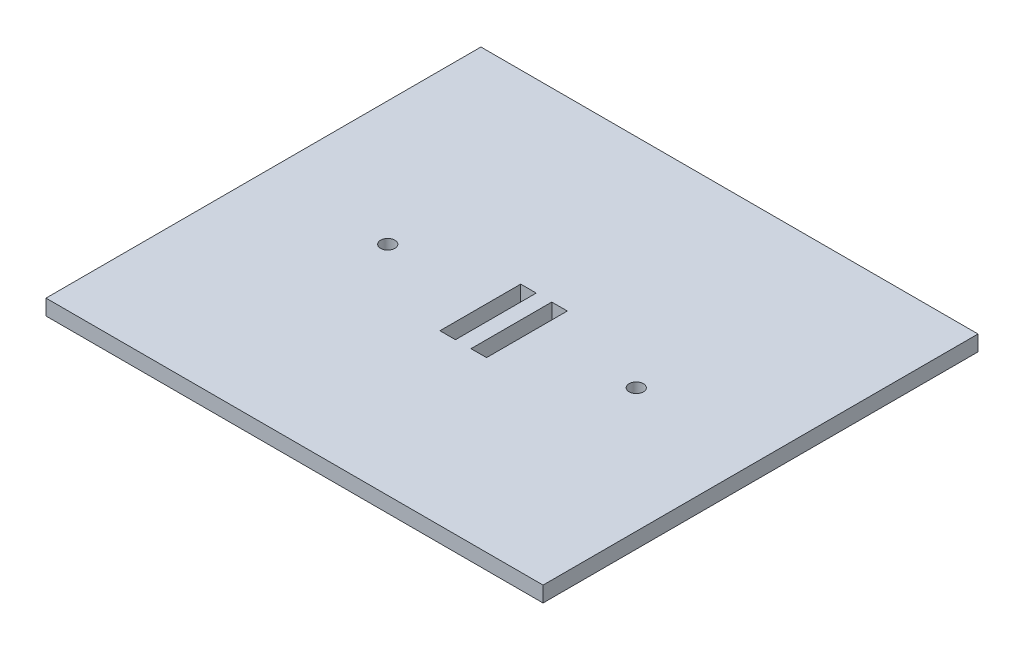
ISO-10303-21;
HEADER;
FILE_DESCRIPTION(('STEP AP214'),'2;1');
FILE_NAME('part.step','',(''),(''),'','','');
FILE_SCHEMA(('AUTOMOTIVE_DESIGN { 1 0 10303 214 1 1 1 1 }'));
ENDSEC;
DATA;
#1=APPLICATION_CONTEXT('core data for automotive mechanical design processes');
#2=APPLICATION_PROTOCOL_DEFINITION('international standard','automotive_design',2000,#1);
#3=PRODUCT_CONTEXT('',#1,'mechanical');
#4=PRODUCT('Part','Part','',(#3));
#5=PRODUCT_RELATED_PRODUCT_CATEGORY('part','',(#4));
#6=PRODUCT_DEFINITION_FORMATION('','',#4);
#7=PRODUCT_DEFINITION_CONTEXT('part definition',#1,'design');
#8=PRODUCT_DEFINITION('design','',#6,#7);
#9=PRODUCT_DEFINITION_SHAPE('','',#8);
#10=(LENGTH_UNIT() NAMED_UNIT(*) SI_UNIT(.MILLI.,.METRE.));
#11=(NAMED_UNIT(*) PLANE_ANGLE_UNIT() SI_UNIT($,.RADIAN.));
#12=(NAMED_UNIT(*) SI_UNIT($,.STERADIAN.) SOLID_ANGLE_UNIT());
#13=UNCERTAINTY_MEASURE_WITH_UNIT(LENGTH_MEASURE(1.E-05),#10,'distance_accuracy_value','');
#14=(GEOMETRIC_REPRESENTATION_CONTEXT(3) GLOBAL_UNCERTAINTY_ASSIGNED_CONTEXT((#13)) GLOBAL_UNIT_ASSIGNED_CONTEXT((#10,
#11,#12)) REPRESENTATION_CONTEXT('',''));
#15=CARTESIAN_POINT('',(0.,0.,0.));
#16=DIRECTION('',(0.,0.,1.));
#17=DIRECTION('',(1.,0.,0.));
#18=AXIS2_PLACEMENT_3D('',#15,#16,#17);
#19=CARTESIAN_POINT('',(50.8,3.175,44.45));
#20=DIRECTION('',(-1.,0.,0.));
#21=DIRECTION('',(0.,0.,1.));
#22=AXIS2_PLACEMENT_3D('',#19,#20,#21);
#23=PLANE('',#22);
#24=DIRECTION('',(0.,0.,-1.));
#25=VECTOR('',#24,1.);
#26=CARTESIAN_POINT('',(50.8,0.,44.45));
#27=LINE('',#26,#25);
#28=CARTESIAN_POINT('',(50.8,0.,44.45));
#29=VERTEX_POINT('',#28);
#30=CARTESIAN_POINT('',(50.8,0.,-44.45));
#31=VERTEX_POINT('',#30);
#32=EDGE_CURVE('E202',#29,#31,#27,.T.);
#33=ORIENTED_EDGE('',*,*,#32,.T.);
#34=DIRECTION('',(0.,-1.,0.));
#35=VECTOR('',#34,1.);
#36=CARTESIAN_POINT('',(50.8,3.175,-44.45));
#37=LINE('',#36,#35);
#38=CARTESIAN_POINT('',(50.8,3.175,-44.45));
#39=VERTEX_POINT('',#38);
#40=EDGE_CURVE('E11',#39,#31,#37,.T.);
#41=ORIENTED_EDGE('',*,*,#40,.F.);
#42=DIRECTION('',(0.,0.,-1.));
#43=VECTOR('',#42,1.);
#44=CARTESIAN_POINT('',(50.8,3.175,44.45));
#45=LINE('',#44,#43);
#46=CARTESIAN_POINT('',(50.8,3.175,44.45));
#47=VERTEX_POINT('',#46);
#48=EDGE_CURVE('E211',#47,#39,#45,.T.);
#49=ORIENTED_EDGE('',*,*,#48,.F.);
#50=DIRECTION('',(0.,-1.,0.));
#51=VECTOR('',#50,1.);
#52=CARTESIAN_POINT('',(50.8,3.175,44.45));
#53=LINE('',#52,#51);
#54=EDGE_CURVE('E221',#47,#29,#53,.T.);
#55=ORIENTED_EDGE('',*,*,#54,.T.);
#56=EDGE_LOOP('',(#33,#41,#49,#55));
#57=FACE_BOUND('',#56,.T.);
#58=ADVANCED_FACE('F41',(#57),#23,.F.);
#59=CARTESIAN_POINT('',(-50.8,3.175,-44.45));
#60=DIRECTION('',(0.,0.,1.));
#61=DIRECTION('',(1.,0.,0.));
#62=AXIS2_PLACEMENT_3D('',#59,#60,#61);
#63=PLANE('',#62);
#64=DIRECTION('',(-1.,0.,0.));
#65=VECTOR('',#64,1.);
#66=CARTESIAN_POINT('',(-50.8,0.,-44.45));
#67=LINE('',#66,#65);
#68=CARTESIAN_POINT('',(-50.8,0.,-44.45));
#69=VERTEX_POINT('',#68);
#70=EDGE_CURVE('E224',#31,#69,#67,.T.);
#71=ORIENTED_EDGE('',*,*,#70,.T.);
#72=DIRECTION('',(0.,-1.,0.));
#73=VECTOR('',#72,1.);
#74=CARTESIAN_POINT('',(-50.8,3.175,-44.45));
#75=LINE('',#74,#73);
#76=CARTESIAN_POINT('',(-50.8,3.175,-44.45));
#77=VERTEX_POINT('',#76);
#78=EDGE_CURVE('E48',#77,#69,#75,.T.);
#79=ORIENTED_EDGE('',*,*,#78,.F.);
#80=DIRECTION('',(-1.,0.,0.));
#81=VECTOR('',#80,1.);
#82=CARTESIAN_POINT('',(-50.8,3.175,-44.45));
#83=LINE('',#82,#81);
#84=EDGE_CURVE('E214',#39,#77,#83,.T.);
#85=ORIENTED_EDGE('',*,*,#84,.F.);
#86=ORIENTED_EDGE('',*,*,#40,.T.);
#87=EDGE_LOOP('',(#71,#79,#85,#86));
#88=FACE_BOUND('',#87,.T.);
#89=ADVANCED_FACE('F253',(#88),#63,.F.);
#90=CARTESIAN_POINT('',(-50.8,3.175,44.45));
#91=DIRECTION('',(1.,0.,0.));
#92=DIRECTION('',(0.,0.,-1.));
#93=AXIS2_PLACEMENT_3D('',#90,#91,#92);
#94=PLANE('',#93);
#95=DIRECTION('',(0.,0.,1.));
#96=VECTOR('',#95,1.);
#97=CARTESIAN_POINT('',(-50.8,0.,44.45));
#98=LINE('',#97,#96);
#99=CARTESIAN_POINT('',(-50.8,0.,44.45));
#100=VERTEX_POINT('',#99);
#101=EDGE_CURVE('E226',#69,#100,#98,.T.);
#102=ORIENTED_EDGE('',*,*,#101,.T.);
#103=DIRECTION('',(0.,-1.,0.));
#104=VECTOR('',#103,1.);
#105=CARTESIAN_POINT('',(-50.8,3.175,44.45));
#106=LINE('',#105,#104);
#107=CARTESIAN_POINT('',(-50.8,3.175,44.45));
#108=VERTEX_POINT('',#107);
#109=EDGE_CURVE('E231',#108,#100,#106,.T.);
#110=ORIENTED_EDGE('',*,*,#109,.F.);
#111=DIRECTION('',(0.,0.,1.));
#112=VECTOR('',#111,1.);
#113=CARTESIAN_POINT('',(-50.8,3.175,44.45));
#114=LINE('',#113,#112);
#115=EDGE_CURVE('E217',#77,#108,#114,.T.);
#116=ORIENTED_EDGE('',*,*,#115,.F.);
#117=ORIENTED_EDGE('',*,*,#78,.T.);
#118=EDGE_LOOP('',(#102,#110,#116,#117));
#119=FACE_BOUND('',#118,.T.);
#120=ADVANCED_FACE('F238',(#119),#94,.F.);
#121=CARTESIAN_POINT('',(-50.8,3.175,44.45));
#122=DIRECTION('',(0.,0.,-1.));
#123=DIRECTION('',(-1.,0.,0.));
#124=AXIS2_PLACEMENT_3D('',#121,#122,#123);
#125=PLANE('',#124);
#126=DIRECTION('',(1.,0.,0.));
#127=VECTOR('',#126,1.);
#128=CARTESIAN_POINT('',(-50.8,0.,44.45));
#129=LINE('',#128,#127);
#130=EDGE_CURVE('E215',#100,#29,#129,.T.);
#131=ORIENTED_EDGE('',*,*,#130,.T.);
#132=ORIENTED_EDGE('',*,*,#54,.F.);
#133=DIRECTION('',(1.,0.,0.));
#134=VECTOR('',#133,1.);
#135=CARTESIAN_POINT('',(-50.8,3.175,44.45));
#136=LINE('',#135,#134);
#137=EDGE_CURVE('E219',#108,#47,#136,.T.);
#138=ORIENTED_EDGE('',*,*,#137,.F.);
#139=ORIENTED_EDGE('',*,*,#109,.T.);
#140=EDGE_LOOP('',(#131,#132,#138,#139));
#141=FACE_BOUND('',#140,.T.);
#142=ADVANCED_FACE('F246',(#141),#125,.F.);
#143=CARTESIAN_POINT('',(0.,3.175,0.));
#144=DIRECTION('',(0.,-1.,0.));
#145=DIRECTION('',(0.,0.,-1.));
#146=AXIS2_PLACEMENT_3D('',#143,#144,#145);
#147=PLANE('',#146);
#148=DIRECTION('',(0.,0.,1.));
#149=VECTOR('',#148,1.);
#150=CARTESIAN_POINT('',(-4.7625,3.175,-6.54118248757117));
#151=LINE('',#150,#149);
#152=CARTESIAN_POINT('',(-4.7625,3.175,-6.54118248757117));
#153=VERTEX_POINT('',#152);
#154=CARTESIAN_POINT('',(-4.7625,3.175,9.96881751242883));
#155=VERTEX_POINT('',#154);
#156=EDGE_CURVE('E159',#153,#155,#151,.T.);
#157=ORIENTED_EDGE('',*,*,#156,.F.);
#158=DIRECTION('',(-1.,0.,0.));
#159=VECTOR('',#158,1.);
#160=CARTESIAN_POINT('',(-1.5875,3.175,-6.54118248757117));
#161=LINE('',#160,#159);
#162=CARTESIAN_POINT('',(-1.5875,3.175,-6.54118248757117));
#163=VERTEX_POINT('',#162);
#164=EDGE_CURVE('E55',#163,#153,#161,.T.);
#165=ORIENTED_EDGE('',*,*,#164,.F.);
#166=DIRECTION('',(0.,0.,-1.));
#167=VECTOR('',#166,1.);
#168=CARTESIAN_POINT('',(-1.5875,3.175,-6.54118248757117));
#169=LINE('',#168,#167);
#170=CARTESIAN_POINT('',(-1.5875,3.175,9.96881751242883));
#171=VERTEX_POINT('',#170);
#172=EDGE_CURVE('E150',#171,#163,#169,.T.);
#173=ORIENTED_EDGE('',*,*,#172,.F.);
#174=DIRECTION('',(1.,0.,0.));
#175=VECTOR('',#174,1.);
#176=CARTESIAN_POINT('',(-4.7625,3.175,9.96881751242883));
#177=LINE('',#176,#175);
#178=EDGE_CURVE('E153',#155,#171,#177,.T.);
#179=ORIENTED_EDGE('',*,*,#178,.F.);
#180=EDGE_LOOP('',(#157,#165,#173,#179));
#181=FACE_BOUND('',#180,.T.);
#182=DIRECTION('',(0.,0.,1.));
#183=VECTOR('',#182,1.);
#184=CARTESIAN_POINT('',(1.58750000000001,3.175,-6.54118248757117));
#185=LINE('',#184,#183);
#186=CARTESIAN_POINT('',(1.58750000000001,3.175,-6.54118248757117));
#187=VERTEX_POINT('',#186);
#188=CARTESIAN_POINT('',(1.58750000000001,3.175,9.96881751242883));
#189=VERTEX_POINT('',#188);
#190=EDGE_CURVE('E185',#187,#189,#185,.T.);
#191=ORIENTED_EDGE('',*,*,#190,.F.);
#192=DIRECTION('',(-1.,0.,0.));
#193=VECTOR('',#192,1.);
#194=CARTESIAN_POINT('',(1.58750000000001,3.175,-6.54118248757117));
#195=LINE('',#194,#193);
#196=CARTESIAN_POINT('',(4.76250000000001,3.175,-6.54118248757117));
#197=VERTEX_POINT('',#196);
#198=EDGE_CURVE('E63',#197,#187,#195,.T.);
#199=ORIENTED_EDGE('',*,*,#198,.F.);
#200=DIRECTION('',(0.,0.,-1.));
#201=VECTOR('',#200,1.);
#202=CARTESIAN_POINT('',(4.76250000000001,3.175,-6.54118248757117));
#203=LINE('',#202,#201);
#204=CARTESIAN_POINT('',(4.76250000000001,3.175,9.96881751242882));
#205=VERTEX_POINT('',#204);
#206=EDGE_CURVE('E178',#205,#197,#203,.T.);
#207=ORIENTED_EDGE('',*,*,#206,.F.);
#208=DIRECTION('',(1.,0.,0.));
#209=VECTOR('',#208,1.);
#210=CARTESIAN_POINT('',(4.76250000000001,3.175,9.96881751242882));
#211=LINE('',#210,#209);
#212=EDGE_CURVE('E181',#189,#205,#211,.T.);
#213=ORIENTED_EDGE('',*,*,#212,.F.);
#214=EDGE_LOOP('',(#191,#199,#207,#213));
#215=FACE_BOUND('',#214,.T.);
#216=CARTESIAN_POINT('',(-25.4,3.175,0.));
#217=DIRECTION('',(0.,1.,0.));
#218=DIRECTION('',(0.,0.,1.));
#219=AXIS2_PLACEMENT_3D('',#216,#217,#218);
#220=CIRCLE('',#219,1.4605);
#221=CARTESIAN_POINT('',(-25.4,3.175,1.4605));
#222=VERTEX_POINT('',#221);
#223=EDGE_CURVE('E203',#222,#222,#220,.T.);
#224=ORIENTED_EDGE('',*,*,#223,.F.);
#225=EDGE_LOOP('',(#224));
#226=FACE_BOUND('',#225,.T.);
#227=CARTESIAN_POINT('',(25.4,3.175,0.));
#228=DIRECTION('',(0.,1.,0.));
#229=DIRECTION('',(0.,0.,1.));
#230=AXIS2_PLACEMENT_3D('',#227,#228,#229);
#231=CIRCLE('',#230,1.4605);
#232=CARTESIAN_POINT('',(25.4,3.175,1.4605));
#233=VERTEX_POINT('',#232);
#234=EDGE_CURVE('E206',#233,#233,#231,.T.);
#235=ORIENTED_EDGE('',*,*,#234,.F.);
#236=EDGE_LOOP('',(#235));
#237=FACE_BOUND('',#236,.T.);
#238=ORIENTED_EDGE('',*,*,#48,.T.);
#239=ORIENTED_EDGE('',*,*,#84,.T.);
#240=ORIENTED_EDGE('',*,*,#115,.T.);
#241=ORIENTED_EDGE('',*,*,#137,.T.);
#242=EDGE_LOOP('',(#238,#239,#240,#241));
#243=FACE_BOUND('',#242,.T.);
#244=ADVANCED_FACE('F252',(#181,#215,#226,#237,#243),#147,.F.);
#245=CARTESIAN_POINT('',(0.,0.,0.));
#246=DIRECTION('',(0.,-1.,0.));
#247=DIRECTION('',(0.,0.,-1.));
#248=AXIS2_PLACEMENT_3D('',#245,#246,#247);
#249=PLANE('',#248);
#250=DIRECTION('',(-1.,0.,0.));
#251=VECTOR('',#250,1.);
#252=CARTESIAN_POINT('',(-1.5875,0.,-6.54118248757117));
#253=LINE('',#252,#251);
#254=CARTESIAN_POINT('',(-1.5875,0.,-6.54118248757117));
#255=VERTEX_POINT('',#254);
#256=CARTESIAN_POINT('',(-4.7625,0.,-6.54118248757117));
#257=VERTEX_POINT('',#256);
#258=EDGE_CURVE('E131',#255,#257,#253,.T.);
#259=ORIENTED_EDGE('',*,*,#258,.T.);
#260=DIRECTION('',(0.,0.,1.));
#261=VECTOR('',#260,1.);
#262=CARTESIAN_POINT('',(-4.7625,0.,-6.54118248757117));
#263=LINE('',#262,#261);
#264=CARTESIAN_POINT('',(-4.7625,0.,9.96881751242883));
#265=VERTEX_POINT('',#264);
#266=EDGE_CURVE('E141',#257,#265,#263,.T.);
#267=ORIENTED_EDGE('',*,*,#266,.T.);
#268=DIRECTION('',(1.,0.,0.));
#269=VECTOR('',#268,1.);
#270=CARTESIAN_POINT('',(-4.7625,0.,9.96881751242883));
#271=LINE('',#270,#269);
#272=CARTESIAN_POINT('',(-1.5875,0.,9.96881751242883));
#273=VERTEX_POINT('',#272);
#274=EDGE_CURVE('E145',#265,#273,#271,.T.);
#275=ORIENTED_EDGE('',*,*,#274,.T.);
#276=DIRECTION('',(0.,0.,-1.));
#277=VECTOR('',#276,1.);
#278=CARTESIAN_POINT('',(-1.5875,0.,-6.54118248757117));
#279=LINE('',#278,#277);
#280=EDGE_CURVE('E137',#273,#255,#279,.T.);
#281=ORIENTED_EDGE('',*,*,#280,.T.);
#282=EDGE_LOOP('',(#259,#267,#275,#281));
#283=FACE_BOUND('',#282,.T.);
#284=DIRECTION('',(-1.,0.,0.));
#285=VECTOR('',#284,1.);
#286=CARTESIAN_POINT('',(1.58750000000001,0.,-6.54118248757117));
#287=LINE('',#286,#285);
#288=CARTESIAN_POINT('',(4.76250000000001,0.,-6.54118248757117));
#289=VERTEX_POINT('',#288);
#290=CARTESIAN_POINT('',(1.58750000000001,0.,-6.54118248757117));
#291=VERTEX_POINT('',#290);
#292=EDGE_CURVE('E182',#289,#291,#287,.T.);
#293=ORIENTED_EDGE('',*,*,#292,.T.);
#294=DIRECTION('',(0.,0.,1.));
#295=VECTOR('',#294,1.);
#296=CARTESIAN_POINT('',(1.58750000000001,0.,-6.54118248757117));
#297=LINE('',#296,#295);
#298=CARTESIAN_POINT('',(1.58750000000001,0.,9.96881751242883));
#299=VERTEX_POINT('',#298);
#300=EDGE_CURVE('E194',#291,#299,#297,.T.);
#301=ORIENTED_EDGE('',*,*,#300,.T.);
#302=DIRECTION('',(1.,0.,0.));
#303=VECTOR('',#302,1.);
#304=CARTESIAN_POINT('',(4.76250000000001,0.,9.96881751242882));
#305=LINE('',#304,#303);
#306=CARTESIAN_POINT('',(4.76250000000001,0.,9.96881751242882));
#307=VERTEX_POINT('',#306);
#308=EDGE_CURVE('E191',#299,#307,#305,.T.);
#309=ORIENTED_EDGE('',*,*,#308,.T.);
#310=DIRECTION('',(0.,0.,-1.));
#311=VECTOR('',#310,1.);
#312=CARTESIAN_POINT('',(4.76250000000001,0.,-6.54118248757117));
#313=LINE('',#312,#311);
#314=EDGE_CURVE('E171',#307,#289,#313,.T.);
#315=ORIENTED_EDGE('',*,*,#314,.T.);
#316=EDGE_LOOP('',(#293,#301,#309,#315));
#317=FACE_BOUND('',#316,.T.);
#318=CARTESIAN_POINT('',(-25.4,0.,0.));
#319=DIRECTION('',(0.,1.,0.));
#320=DIRECTION('',(0.,0.,1.));
#321=AXIS2_PLACEMENT_3D('',#318,#319,#320);
#322=CIRCLE('',#321,1.4605);
#323=CARTESIAN_POINT('',(-25.4,0.,1.4605));
#324=VERTEX_POINT('',#323);
#325=EDGE_CURVE('E199',#324,#324,#322,.T.);
#326=ORIENTED_EDGE('',*,*,#325,.T.);
#327=EDGE_LOOP('',(#326));
#328=FACE_BOUND('',#327,.T.);
#329=CARTESIAN_POINT('',(25.4,0.,0.));
#330=DIRECTION('',(0.,1.,0.));
#331=DIRECTION('',(0.,0.,1.));
#332=AXIS2_PLACEMENT_3D('',#329,#330,#331);
#333=CIRCLE('',#332,1.4605);
#334=CARTESIAN_POINT('',(25.4,0.,1.4605));
#335=VERTEX_POINT('',#334);
#336=EDGE_CURVE('E165',#335,#335,#333,.T.);
#337=ORIENTED_EDGE('',*,*,#336,.T.);
#338=EDGE_LOOP('',(#337));
#339=FACE_BOUND('',#338,.T.);
#340=ORIENTED_EDGE('',*,*,#32,.F.);
#341=ORIENTED_EDGE('',*,*,#130,.F.);
#342=ORIENTED_EDGE('',*,*,#101,.F.);
#343=ORIENTED_EDGE('',*,*,#70,.F.);
#344=EDGE_LOOP('',(#340,#341,#342,#343));
#345=FACE_BOUND('',#344,.T.);
#346=ADVANCED_FACE('F147',(#283,#317,#328,#339,#345),#249,.T.);
#347=CARTESIAN_POINT('',(25.4,0.,0.));
#348=DIRECTION('',(0.,1.,0.));
#349=DIRECTION('',(0.,0.,1.));
#350=AXIS2_PLACEMENT_3D('',#347,#348,#349);
#351=CYLINDRICAL_SURFACE('',#350,1.4605);
#352=ORIENTED_EDGE('',*,*,#336,.F.);
#353=EDGE_LOOP('',(#352));
#354=FACE_BOUND('',#353,.T.);
#355=ORIENTED_EDGE('',*,*,#234,.T.);
#356=EDGE_LOOP('',(#355));
#357=FACE_BOUND('',#356,.T.);
#358=ADVANCED_FACE('F265',(#354,#357),#351,.F.);
#359=CARTESIAN_POINT('',(-25.4,0.,0.));
#360=DIRECTION('',(0.,1.,0.));
#361=DIRECTION('',(0.,0.,1.));
#362=AXIS2_PLACEMENT_3D('',#359,#360,#361);
#363=CYLINDRICAL_SURFACE('',#362,1.4605);
#364=ORIENTED_EDGE('',*,*,#325,.F.);
#365=EDGE_LOOP('',(#364));
#366=FACE_BOUND('',#365,.T.);
#367=ORIENTED_EDGE('',*,*,#223,.T.);
#368=EDGE_LOOP('',(#367));
#369=FACE_BOUND('',#368,.T.);
#370=ADVANCED_FACE('F271',(#366,#369),#363,.F.);
#371=CARTESIAN_POINT('',(1.58750000000001,0.,-6.54118248757117));
#372=DIRECTION('',(0.,0.,-1.));
#373=DIRECTION('',(-1.,0.,0.));
#374=AXIS2_PLACEMENT_3D('',#371,#372,#373);
#375=PLANE('',#374);
#376=ORIENTED_EDGE('',*,*,#198,.T.);
#377=DIRECTION('',(0.,1.,0.));
#378=VECTOR('',#377,1.);
#379=CARTESIAN_POINT('',(1.58750000000001,0.,-6.54118248757117));
#380=LINE('',#379,#378);
#381=EDGE_CURVE('E169',#291,#187,#380,.T.);
#382=ORIENTED_EDGE('',*,*,#381,.F.);
#383=ORIENTED_EDGE('',*,*,#292,.F.);
#384=DIRECTION('',(0.,1.,0.));
#385=VECTOR('',#384,1.);
#386=CARTESIAN_POINT('',(4.76250000000001,0.,-6.54118248757117));
#387=LINE('',#386,#385);
#388=EDGE_CURVE('E176',#289,#197,#387,.T.);
#389=ORIENTED_EDGE('',*,*,#388,.T.);
#390=EDGE_LOOP('',(#376,#382,#383,#389));
#391=FACE_BOUND('',#390,.T.);
#392=ADVANCED_FACE('F275',(#391),#375,.F.);
#393=CARTESIAN_POINT('',(4.76250000000001,0.,-6.54118248757117));
#394=DIRECTION('',(1.,0.,0.));
#395=DIRECTION('',(0.,0.,-1.));
#396=AXIS2_PLACEMENT_3D('',#393,#394,#395);
#397=PLANE('',#396);
#398=ORIENTED_EDGE('',*,*,#206,.T.);
#399=ORIENTED_EDGE('',*,*,#388,.F.);
#400=ORIENTED_EDGE('',*,*,#314,.F.);
#401=DIRECTION('',(0.,1.,0.));
#402=VECTOR('',#401,1.);
#403=CARTESIAN_POINT('',(4.76250000000001,0.,9.96881751242882));
#404=LINE('',#403,#402);
#405=EDGE_CURVE('E174',#307,#205,#404,.T.);
#406=ORIENTED_EDGE('',*,*,#405,.T.);
#407=EDGE_LOOP('',(#398,#399,#400,#406));
#408=FACE_BOUND('',#407,.T.);
#409=ADVANCED_FACE('F277',(#408),#397,.F.);
#410=CARTESIAN_POINT('',(4.76250000000001,0.,9.96881751242882));
#411=DIRECTION('',(0.,0.,1.));
#412=DIRECTION('',(1.,0.,0.));
#413=AXIS2_PLACEMENT_3D('',#410,#411,#412);
#414=PLANE('',#413);
#415=ORIENTED_EDGE('',*,*,#212,.T.);
#416=ORIENTED_EDGE('',*,*,#405,.F.);
#417=ORIENTED_EDGE('',*,*,#308,.F.);
#418=DIRECTION('',(0.,1.,0.));
#419=VECTOR('',#418,1.);
#420=CARTESIAN_POINT('',(1.58750000000001,0.,9.96881751242883));
#421=LINE('',#420,#419);
#422=EDGE_CURVE('E172',#299,#189,#421,.T.);
#423=ORIENTED_EDGE('',*,*,#422,.T.);
#424=EDGE_LOOP('',(#415,#416,#417,#423));
#425=FACE_BOUND('',#424,.T.);
#426=ADVANCED_FACE('F280',(#425),#414,.F.);
#427=CARTESIAN_POINT('',(1.58750000000001,0.,-6.54118248757117));
#428=DIRECTION('',(-1.,0.,0.));
#429=DIRECTION('',(0.,0.,1.));
#430=AXIS2_PLACEMENT_3D('',#427,#428,#429);
#431=PLANE('',#430);
#432=ORIENTED_EDGE('',*,*,#190,.T.);
#433=ORIENTED_EDGE('',*,*,#422,.F.);
#434=ORIENTED_EDGE('',*,*,#300,.F.);
#435=ORIENTED_EDGE('',*,*,#381,.T.);
#436=EDGE_LOOP('',(#432,#433,#434,#435));
#437=FACE_BOUND('',#436,.T.);
#438=ADVANCED_FACE('F284',(#437),#431,.F.);
#439=CARTESIAN_POINT('',(-1.5875,0.,-6.54118248757117));
#440=DIRECTION('',(0.,0.,-1.));
#441=DIRECTION('',(-1.,0.,0.));
#442=AXIS2_PLACEMENT_3D('',#439,#440,#441);
#443=PLANE('',#442);
#444=ORIENTED_EDGE('',*,*,#164,.T.);
#445=DIRECTION('',(0.,1.,0.));
#446=VECTOR('',#445,1.);
#447=CARTESIAN_POINT('',(-4.7625,0.,-6.54118248757117));
#448=LINE('',#447,#446);
#449=EDGE_CURVE('E127',#257,#153,#448,.T.);
#450=ORIENTED_EDGE('',*,*,#449,.F.);
#451=ORIENTED_EDGE('',*,*,#258,.F.);
#452=DIRECTION('',(0.,1.,0.));
#453=VECTOR('',#452,1.);
#454=CARTESIAN_POINT('',(-1.5875,0.,-6.54118248757117));
#455=LINE('',#454,#453);
#456=EDGE_CURVE('E163',#255,#163,#455,.T.);
#457=ORIENTED_EDGE('',*,*,#456,.T.);
#458=EDGE_LOOP('',(#444,#450,#451,#457));
#459=FACE_BOUND('',#458,.T.);
#460=ADVANCED_FACE('F129',(#459),#443,.F.);
#461=CARTESIAN_POINT('',(-1.5875,0.,-6.54118248757117));
#462=DIRECTION('',(1.,0.,0.));
#463=DIRECTION('',(0.,0.,-1.));
#464=AXIS2_PLACEMENT_3D('',#461,#462,#463);
#465=PLANE('',#464);
#466=ORIENTED_EDGE('',*,*,#172,.T.);
#467=ORIENTED_EDGE('',*,*,#456,.F.);
#468=ORIENTED_EDGE('',*,*,#280,.F.);
#469=DIRECTION('',(0.,1.,0.));
#470=VECTOR('',#469,1.);
#471=CARTESIAN_POINT('',(-1.5875,0.,9.96881751242883));
#472=LINE('',#471,#470);
#473=EDGE_CURVE('E166',#273,#171,#472,.T.);
#474=ORIENTED_EDGE('',*,*,#473,.T.);
#475=EDGE_LOOP('',(#466,#467,#468,#474));
#476=FACE_BOUND('',#475,.T.);
#477=ADVANCED_FACE('F293',(#476),#465,.F.);
#478=CARTESIAN_POINT('',(-4.7625,0.,9.96881751242883));
#479=DIRECTION('',(0.,0.,1.));
#480=DIRECTION('',(1.,0.,0.));
#481=AXIS2_PLACEMENT_3D('',#478,#479,#480);
#482=PLANE('',#481);
#483=ORIENTED_EDGE('',*,*,#178,.T.);
#484=ORIENTED_EDGE('',*,*,#473,.F.);
#485=ORIENTED_EDGE('',*,*,#274,.F.);
#486=DIRECTION('',(0.,1.,0.));
#487=VECTOR('',#486,1.);
#488=CARTESIAN_POINT('',(-4.7625,0.,9.96881751242883));
#489=LINE('',#488,#487);
#490=EDGE_CURVE('E136',#265,#155,#489,.T.);
#491=ORIENTED_EDGE('',*,*,#490,.T.);
#492=EDGE_LOOP('',(#483,#484,#485,#491));
#493=FACE_BOUND('',#492,.T.);
#494=ADVANCED_FACE('F296',(#493),#482,.F.);
#495=CARTESIAN_POINT('',(-4.7625,0.,-6.54118248757117));
#496=DIRECTION('',(-1.,0.,0.));
#497=DIRECTION('',(0.,0.,1.));
#498=AXIS2_PLACEMENT_3D('',#495,#496,#497);
#499=PLANE('',#498);
#500=ORIENTED_EDGE('',*,*,#156,.T.);
#501=ORIENTED_EDGE('',*,*,#490,.F.);
#502=ORIENTED_EDGE('',*,*,#266,.F.);
#503=ORIENTED_EDGE('',*,*,#449,.T.);
#504=EDGE_LOOP('',(#500,#501,#502,#503));
#505=FACE_BOUND('',#504,.T.);
#506=ADVANCED_FACE('F142',(#505),#499,.F.);
#507=CLOSED_SHELL('',(#58,#89,#120,#142,#244,#346,#358,#370,#392,#409,#426,#438,#460,#477,#494,#506));
#508=MANIFOLD_SOLID_BREP('B2',#507);
#509=ADVANCED_BREP_SHAPE_REPRESENTATION('',(#18,#508),#14);
#510=SHAPE_DEFINITION_REPRESENTATION(#9,#509);
ENDSEC;
END-ISO-10303-21;
